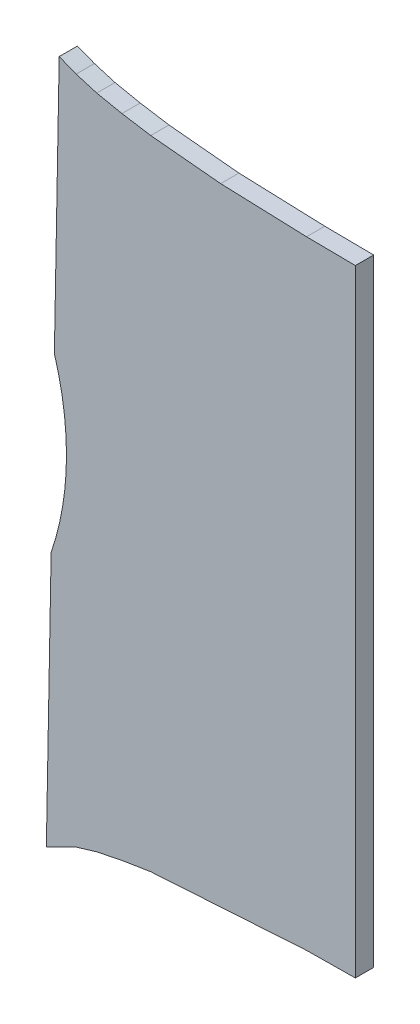
ISO-10303-21;
HEADER;
FILE_DESCRIPTION(('STEP AP214'),'2;1');
FILE_NAME('part.step','',(''),(''),'','','');
FILE_SCHEMA(('AUTOMOTIVE_DESIGN { 1 0 10303 214 1 1 1 1 }'));
ENDSEC;
DATA;
#1=APPLICATION_CONTEXT('core data for automotive mechanical design processes');
#2=APPLICATION_PROTOCOL_DEFINITION('international standard','automotive_design',2000,#1);
#3=PRODUCT_CONTEXT('',#1,'mechanical');
#4=PRODUCT('Part','Part','',(#3));
#5=PRODUCT_RELATED_PRODUCT_CATEGORY('part','',(#4));
#6=PRODUCT_DEFINITION_FORMATION('','',#4);
#7=PRODUCT_DEFINITION_CONTEXT('part definition',#1,'design');
#8=PRODUCT_DEFINITION('design','',#6,#7);
#9=PRODUCT_DEFINITION_SHAPE('','',#8);
#10=(LENGTH_UNIT() NAMED_UNIT(*) SI_UNIT(.MILLI.,.METRE.));
#11=(NAMED_UNIT(*) PLANE_ANGLE_UNIT() SI_UNIT($,.RADIAN.));
#12=(NAMED_UNIT(*) SI_UNIT($,.STERADIAN.) SOLID_ANGLE_UNIT());
#13=UNCERTAINTY_MEASURE_WITH_UNIT(LENGTH_MEASURE(1.E-05),#10,'distance_accuracy_value','');
#14=(GEOMETRIC_REPRESENTATION_CONTEXT(3) GLOBAL_UNCERTAINTY_ASSIGNED_CONTEXT((#13)) GLOBAL_UNIT_ASSIGNED_CONTEXT((#10,
#11,#12)) REPRESENTATION_CONTEXT('',''));
#15=CARTESIAN_POINT('',(0.,0.,0.));
#16=DIRECTION('',(0.,0.,1.));
#17=DIRECTION('',(1.,0.,0.));
#18=AXIS2_PLACEMENT_3D('',#15,#16,#17);
#19=CARTESIAN_POINT('',(104.657997131348,70.0309982299805,0.));
#20=DIRECTION('',(-1.,0.,0.));
#21=DIRECTION('',(0.,1.,0.));
#22=AXIS2_PLACEMENT_3D('',#19,#20,#21);
#23=PLANE('',#22);
#24=DIRECTION('',(0.,1.,0.));
#25=VECTOR('',#24,1.);
#26=CARTESIAN_POINT('',(104.657997131348,70.0309982299805,0.03556));
#27=LINE('',#26,#25);
#28=CARTESIAN_POINT('',(104.657997131348,70.0309982299805,0.03556));
#29=VERTEX_POINT('',#28);
#30=CARTESIAN_POINT('',(104.657997131348,71.2310028076172,0.03556));
#31=VERTEX_POINT('',#30);
#32=EDGE_CURVE('E11',#29,#31,#27,.T.);
#33=ORIENTED_EDGE('',*,*,#32,.F.);
#34=DIRECTION('',(0.,0.,1.));
#35=VECTOR('',#34,1.);
#36=CARTESIAN_POINT('',(104.657997131348,70.0309982299805,0.));
#37=LINE('',#36,#35);
#38=CARTESIAN_POINT('',(104.657997131348,70.0309982299805,0.));
#39=VERTEX_POINT('',#38);
#40=EDGE_CURVE('E24',#39,#29,#37,.T.);
#41=ORIENTED_EDGE('',*,*,#40,.F.);
#42=DIRECTION('',(0.,1.,0.));
#43=VECTOR('',#42,1.);
#44=CARTESIAN_POINT('',(104.657997131348,70.0309982299805,0.));
#45=LINE('',#44,#43);
#46=CARTESIAN_POINT('',(104.657997131348,71.2310028076172,0.));
#47=VERTEX_POINT('',#46);
#48=EDGE_CURVE('E281',#39,#47,#45,.T.);
#49=ORIENTED_EDGE('',*,*,#48,.T.);
#50=DIRECTION('',(0.,0.,1.));
#51=VECTOR('',#50,1.);
#52=CARTESIAN_POINT('',(104.657997131348,71.2310028076172,0.));
#53=LINE('',#52,#51);
#54=EDGE_CURVE('E37',#47,#31,#53,.T.);
#55=ORIENTED_EDGE('',*,*,#54,.T.);
#56=EDGE_LOOP('',(#33,#41,#49,#55));
#57=FACE_BOUND('',#56,.T.);
#58=ADVANCED_FACE('F17',(#57),#23,.F.);
#59=CARTESIAN_POINT('',(104.563003540039,70.0299987792969,0.));
#60=DIRECTION('',(-0.0105206609892561,0.999944656314713,0.));
#61=DIRECTION('',(0.999944656314713,0.0105206609892561,0.));
#62=AXIS2_PLACEMENT_3D('',#59,#60,#61);
#63=PLANE('',#62);
#64=DIRECTION('',(0.999944656314713,0.0105206609892561,0.));
#65=VECTOR('',#64,1.);
#66=CARTESIAN_POINT('',(104.563003540039,70.0299987792969,0.03556));
#67=LINE('',#66,#65);
#68=CARTESIAN_POINT('',(104.563003540039,70.0299987792969,0.03556));
#69=VERTEX_POINT('',#68);
#70=EDGE_CURVE('E277',#69,#29,#67,.T.);
#71=ORIENTED_EDGE('',*,*,#70,.F.);
#72=DIRECTION('',(0.,0.,1.));
#73=VECTOR('',#72,1.);
#74=CARTESIAN_POINT('',(104.563003540039,70.0299987792969,0.));
#75=LINE('',#74,#73);
#76=CARTESIAN_POINT('',(104.563003540039,70.0299987792969,0.));
#77=VERTEX_POINT('',#76);
#78=EDGE_CURVE('E275',#77,#69,#75,.T.);
#79=ORIENTED_EDGE('',*,*,#78,.F.);
#80=DIRECTION('',(0.999944656314713,0.0105206609892561,0.));
#81=VECTOR('',#80,1.);
#82=CARTESIAN_POINT('',(104.563003540039,70.0299987792969,0.));
#83=LINE('',#82,#81);
#84=EDGE_CURVE('E273',#77,#39,#83,.T.);
#85=ORIENTED_EDGE('',*,*,#84,.T.);
#86=ORIENTED_EDGE('',*,*,#40,.T.);
#87=EDGE_LOOP('',(#71,#79,#85,#86));
#88=FACE_BOUND('',#87,.T.);
#89=ADVANCED_FACE('F284',(#88),#63,.F.);
#90=CARTESIAN_POINT('',(104.26000213623,70.0110015869141,0.));
#91=DIRECTION('',(-0.0625738496276475,0.998040336530932,0.));
#92=DIRECTION('',(0.998040336530932,0.0625738496276475,0.));
#93=AXIS2_PLACEMENT_3D('',#90,#91,#92);
#94=PLANE('',#93);
#95=DIRECTION('',(0.998040336530932,0.0625738496276475,0.));
#96=VECTOR('',#95,1.);
#97=CARTESIAN_POINT('',(104.26000213623,70.0110015869141,0.03556));
#98=LINE('',#97,#96);
#99=CARTESIAN_POINT('',(104.26000213623,70.0110015869141,0.03556));
#100=VERTEX_POINT('',#99);
#101=EDGE_CURVE('E270',#100,#69,#98,.T.);
#102=ORIENTED_EDGE('',*,*,#101,.F.);
#103=DIRECTION('',(0.,0.,1.));
#104=VECTOR('',#103,1.);
#105=CARTESIAN_POINT('',(104.26000213623,70.0110015869141,0.));
#106=LINE('',#105,#104);
#107=CARTESIAN_POINT('',(104.26000213623,70.0110015869141,0.));
#108=VERTEX_POINT('',#107);
#109=EDGE_CURVE('E268',#108,#100,#106,.T.);
#110=ORIENTED_EDGE('',*,*,#109,.F.);
#111=DIRECTION('',(0.998040336530932,0.0625738496276475,0.));
#112=VECTOR('',#111,1.);
#113=CARTESIAN_POINT('',(104.26000213623,70.0110015869141,0.));
#114=LINE('',#113,#112);
#115=EDGE_CURVE('E265',#108,#77,#114,.T.);
#116=ORIENTED_EDGE('',*,*,#115,.T.);
#117=ORIENTED_EDGE('',*,*,#78,.T.);
#118=EDGE_LOOP('',(#102,#110,#116,#117));
#119=FACE_BOUND('',#118,.T.);
#120=ADVANCED_FACE('F287',(#119),#94,.F.);
#121=CARTESIAN_POINT('',(104.204002380371,70.0019989013672,0.));
#122=DIRECTION('',(-0.158724925844647,0.987322843813315,0.));
#123=DIRECTION('',(0.987322843813315,0.158724925844647,0.));
#124=AXIS2_PLACEMENT_3D('',#121,#122,#123);
#125=PLANE('',#124);
#126=DIRECTION('',(0.987322843813315,0.158724925844647,0.));
#127=VECTOR('',#126,1.);
#128=CARTESIAN_POINT('',(104.204002380371,70.0019989013672,0.03556));
#129=LINE('',#128,#127);
#130=CARTESIAN_POINT('',(104.204002380371,70.0019989013672,0.03556));
#131=VERTEX_POINT('',#130);
#132=EDGE_CURVE('E262',#131,#100,#129,.T.);
#133=ORIENTED_EDGE('',*,*,#132,.F.);
#134=DIRECTION('',(0.,0.,1.));
#135=VECTOR('',#134,1.);
#136=CARTESIAN_POINT('',(104.204002380371,70.0019989013672,0.));
#137=LINE('',#136,#135);
#138=CARTESIAN_POINT('',(104.204002380371,70.0019989013672,0.));
#139=VERTEX_POINT('',#138);
#140=EDGE_CURVE('E260',#139,#131,#137,.T.);
#141=ORIENTED_EDGE('',*,*,#140,.F.);
#142=DIRECTION('',(0.987322843813315,0.158724925844647,0.));
#143=VECTOR('',#142,1.);
#144=CARTESIAN_POINT('',(104.204002380371,70.0019989013672,0.));
#145=LINE('',#144,#143);
#146=EDGE_CURVE('E257',#139,#108,#145,.T.);
#147=ORIENTED_EDGE('',*,*,#146,.T.);
#148=ORIENTED_EDGE('',*,*,#109,.T.);
#149=EDGE_LOOP('',(#133,#141,#147,#148));
#150=FACE_BOUND('',#149,.T.);
#151=ADVANCED_FACE('F292',(#150),#125,.F.);
#152=CARTESIAN_POINT('',(104.154998779297,69.9919967651367,0.));
#153=DIRECTION('',(-0.199986910155218,0.979798568975567,0.));
#154=DIRECTION('',(0.979798568975567,0.199986910155218,0.));
#155=AXIS2_PLACEMENT_3D('',#152,#153,#154);
#156=PLANE('',#155);
#157=DIRECTION('',(0.979798568975567,0.199986910155218,0.));
#158=VECTOR('',#157,1.);
#159=CARTESIAN_POINT('',(104.154998779297,69.9919967651367,0.03556));
#160=LINE('',#159,#158);
#161=CARTESIAN_POINT('',(104.154998779297,69.9919967651367,0.03556));
#162=VERTEX_POINT('',#161);
#163=EDGE_CURVE('E254',#162,#131,#160,.T.);
#164=ORIENTED_EDGE('',*,*,#163,.F.);
#165=DIRECTION('',(0.,0.,1.));
#166=VECTOR('',#165,1.);
#167=CARTESIAN_POINT('',(104.154998779297,69.9919967651367,0.));
#168=LINE('',#167,#166);
#169=CARTESIAN_POINT('',(104.154998779297,69.9919967651367,0.));
#170=VERTEX_POINT('',#169);
#171=EDGE_CURVE('E252',#170,#162,#168,.T.);
#172=ORIENTED_EDGE('',*,*,#171,.F.);
#173=DIRECTION('',(0.979798568975567,0.199986910155218,0.));
#174=VECTOR('',#173,1.);
#175=CARTESIAN_POINT('',(104.154998779297,69.9919967651367,0.));
#176=LINE('',#175,#174);
#177=EDGE_CURVE('E249',#170,#139,#176,.T.);
#178=ORIENTED_EDGE('',*,*,#177,.T.);
#179=ORIENTED_EDGE('',*,*,#140,.T.);
#180=EDGE_LOOP('',(#164,#172,#178,#179));
#181=FACE_BOUND('',#180,.T.);
#182=ADVANCED_FACE('F295',(#181),#156,.F.);
#183=CARTESIAN_POINT('',(104.11499786377,69.9800033569336,0.));
#184=DIRECTION('',(-0.287197032661388,0.95787152814482,0.));
#185=DIRECTION('',(0.95787152814482,0.287197032661388,0.));
#186=AXIS2_PLACEMENT_3D('',#183,#184,#185);
#187=PLANE('',#186);
#188=DIRECTION('',(0.95787152814482,0.287197032661388,0.));
#189=VECTOR('',#188,1.);
#190=CARTESIAN_POINT('',(104.11499786377,69.9800033569336,0.03556));
#191=LINE('',#190,#189);
#192=CARTESIAN_POINT('',(104.11499786377,69.9800033569336,0.03556));
#193=VERTEX_POINT('',#192);
#194=EDGE_CURVE('E246',#193,#162,#191,.T.);
#195=ORIENTED_EDGE('',*,*,#194,.F.);
#196=DIRECTION('',(0.,0.,1.));
#197=VECTOR('',#196,1.);
#198=CARTESIAN_POINT('',(104.11499786377,69.9800033569336,0.));
#199=LINE('',#198,#197);
#200=CARTESIAN_POINT('',(104.11499786377,69.9800033569336,0.));
#201=VERTEX_POINT('',#200);
#202=EDGE_CURVE('E244',#201,#193,#199,.T.);
#203=ORIENTED_EDGE('',*,*,#202,.F.);
#204=DIRECTION('',(0.95787152814482,0.287197032661388,0.));
#205=VECTOR('',#204,1.);
#206=CARTESIAN_POINT('',(104.11499786377,69.9800033569336,0.));
#207=LINE('',#206,#205);
#208=EDGE_CURVE('E241',#201,#170,#207,.T.);
#209=ORIENTED_EDGE('',*,*,#208,.T.);
#210=ORIENTED_EDGE('',*,*,#171,.T.);
#211=EDGE_LOOP('',(#195,#203,#209,#210));
#212=FACE_BOUND('',#211,.T.);
#213=ADVANCED_FACE('F300',(#212),#187,.F.);
#214=CARTESIAN_POINT('',(104.056999206543,69.9509963989258,0.));
#215=DIRECTION('',(-0.447307713531729,0.894380125793847,0.));
#216=DIRECTION('',(0.894380125793847,0.447307713531729,0.));
#217=AXIS2_PLACEMENT_3D('',#214,#215,#216);
#218=PLANE('',#217);
#219=DIRECTION('',(0.894380125793847,0.447307713531729,0.));
#220=VECTOR('',#219,1.);
#221=CARTESIAN_POINT('',(104.056999206543,69.9509963989258,0.03556));
#222=LINE('',#221,#220);
#223=CARTESIAN_POINT('',(104.056999206543,69.9509963989258,0.03556));
#224=VERTEX_POINT('',#223);
#225=EDGE_CURVE('E238',#224,#193,#222,.T.);
#226=ORIENTED_EDGE('',*,*,#225,.F.);
#227=DIRECTION('',(0.,0.,1.));
#228=VECTOR('',#227,1.);
#229=CARTESIAN_POINT('',(104.056999206543,69.9509963989258,0.));
#230=LINE('',#229,#228);
#231=CARTESIAN_POINT('',(104.056999206543,69.9509963989258,0.));
#232=VERTEX_POINT('',#231);
#233=EDGE_CURVE('E236',#232,#224,#230,.T.);
#234=ORIENTED_EDGE('',*,*,#233,.F.);
#235=DIRECTION('',(0.894380125793847,0.447307713531729,0.));
#236=VECTOR('',#235,1.);
#237=CARTESIAN_POINT('',(104.056999206543,69.9509963989258,0.));
#238=LINE('',#237,#236);
#239=EDGE_CURVE('E233',#232,#201,#238,.T.);
#240=ORIENTED_EDGE('',*,*,#239,.T.);
#241=ORIENTED_EDGE('',*,*,#202,.T.);
#242=EDGE_LOOP('',(#226,#234,#240,#241));
#243=FACE_BOUND('',#242,.T.);
#244=ADVANCED_FACE('F303',(#243),#218,.F.);
#245=CARTESIAN_POINT('',(104.066322617947,70.4521930655177,0.));
#246=DIRECTION('',(0.999827022085491,-0.0185990835166362,0.));
#247=DIRECTION('',(-0.0185990835166362,-0.999827022085491,0.));
#248=AXIS2_PLACEMENT_3D('',#245,#246,#247);
#249=PLANE('',#248);
#250=DIRECTION('',(-0.0185990835166362,-0.999827022085491,0.));
#251=VECTOR('',#250,1.);
#252=CARTESIAN_POINT('',(104.082000732422,71.2949981689453,0.03556));
#253=LINE('',#252,#251);
#254=CARTESIAN_POINT('',(104.066322617947,70.4521930655177,0.03556));
#255=VERTEX_POINT('',#254);
#256=EDGE_CURVE('E230',#255,#224,#253,.T.);
#257=ORIENTED_EDGE('',*,*,#256,.F.);
#258=DIRECTION('',(0.,0.,1.));
#259=VECTOR('',#258,1.);
#260=CARTESIAN_POINT('',(104.066322617947,70.4521930655177,0.));
#261=LINE('',#260,#259);
#262=CARTESIAN_POINT('',(104.066322617947,70.4521930655177,0.));
#263=VERTEX_POINT('',#262);
#264=EDGE_CURVE('E228',#263,#255,#261,.T.);
#265=ORIENTED_EDGE('',*,*,#264,.F.);
#266=DIRECTION('',(-0.0185990835166362,-0.999827022085491,0.));
#267=VECTOR('',#266,1.);
#268=CARTESIAN_POINT('',(104.082000732422,71.2949981689453,0.));
#269=LINE('',#268,#267);
#270=EDGE_CURVE('E225',#263,#232,#269,.T.);
#271=ORIENTED_EDGE('',*,*,#270,.T.);
#272=ORIENTED_EDGE('',*,*,#233,.T.);
#273=EDGE_LOOP('',(#257,#265,#271,#272));
#274=FACE_BOUND('',#273,.T.);
#275=ADVANCED_FACE('F308',(#274),#249,.F.);
#276=CARTESIAN_POINT('',(103.546148,70.6308468,0.));
#277=DIRECTION('',(0.,0.,-1.));
#278=DIRECTION('',(1.,0.,0.));
#279=AXIS2_PLACEMENT_3D('',#276,#277,#278);
#280=CYLINDRICAL_SURFACE('',#279,0.5499989);
#281=ORIENTED_EDGE('',*,*,#264,.T.);
#282=CARTESIAN_POINT('',(103.546148,70.6308468,0.03556));
#283=DIRECTION('',(0.,0.,1.));
#284=DIRECTION('',(1.,0.,0.));
#285=AXIS2_PLACEMENT_3D('',#282,#283,#284);
#286=CIRCLE('',#285,0.5499989);
#287=CARTESIAN_POINT('',(104.0961469,70.6308468,0.03556));
#288=VERTEX_POINT('',#287);
#289=EDGE_CURVE('E222',#255,#288,#286,.T.);
#290=ORIENTED_EDGE('',*,*,#289,.T.);
#291=DIRECTION('',(0.,0.,1.));
#292=VECTOR('',#291,1.);
#293=CARTESIAN_POINT('',(104.0961469,70.6308468,0.));
#294=LINE('',#293,#292);
#295=CARTESIAN_POINT('',(104.0961469,70.6308468,0.));
#296=VERTEX_POINT('',#295);
#297=EDGE_CURVE('E220',#296,#288,#294,.T.);
#298=ORIENTED_EDGE('',*,*,#297,.F.);
#299=CARTESIAN_POINT('',(103.546148,70.6308468,0.));
#300=DIRECTION('',(0.,0.,1.));
#301=DIRECTION('',(1.,0.,0.));
#302=AXIS2_PLACEMENT_3D('',#299,#300,#301);
#303=CIRCLE('',#302,0.5499989);
#304=EDGE_CURVE('E217',#263,#296,#303,.T.);
#305=ORIENTED_EDGE('',*,*,#304,.F.);
#306=EDGE_LOOP('',(#281,#290,#298,#305));
#307=FACE_BOUND('',#306,.T.);
#308=ADVANCED_FACE('F311',(#307),#280,.F.);
#309=CARTESIAN_POINT('',(103.546148,70.6308468,0.));
#310=DIRECTION('',(0.,0.,-1.));
#311=DIRECTION('',(1.,0.,0.));
#312=AXIS2_PLACEMENT_3D('',#309,#310,#311);
#313=CYLINDRICAL_SURFACE('',#312,0.5499989);
#314=ORIENTED_EDGE('',*,*,#297,.T.);
#315=CARTESIAN_POINT('',(103.546148,70.6308468,0.03556));
#316=DIRECTION('',(0.,0.,1.));
#317=DIRECTION('',(1.,0.,0.));
#318=AXIS2_PLACEMENT_3D('',#315,#316,#317);
#319=CIRCLE('',#318,0.5499989);
#320=CARTESIAN_POINT('',(104.07260717611,70.7900307372904,0.03556));
#321=VERTEX_POINT('',#320);
#322=EDGE_CURVE('E214',#288,#321,#319,.T.);
#323=ORIENTED_EDGE('',*,*,#322,.T.);
#324=DIRECTION('',(0.,0.,1.));
#325=VECTOR('',#324,1.);
#326=CARTESIAN_POINT('',(104.07260717611,70.7900307372904,0.));
#327=LINE('',#326,#325);
#328=CARTESIAN_POINT('',(104.07260717611,70.7900307372904,0.));
#329=VERTEX_POINT('',#328);
#330=EDGE_CURVE('E212',#329,#321,#327,.T.);
#331=ORIENTED_EDGE('',*,*,#330,.F.);
#332=EDGE_CURVE('E211',#296,#329,#303,.T.);
#333=ORIENTED_EDGE('',*,*,#332,.F.);
#334=EDGE_LOOP('',(#314,#323,#331,#333));
#335=FACE_BOUND('',#334,.T.);
#336=ADVANCED_FACE('F318',(#335),#313,.F.);
#337=CARTESIAN_POINT('',(104.082000732422,71.2949981689453,0.));
#338=DIRECTION('',(0.999827022085491,-0.0185990835166362,0.));
#339=DIRECTION('',(-0.0185990835166362,-0.999827022085491,0.));
#340=AXIS2_PLACEMENT_3D('',#337,#338,#339);
#341=PLANE('',#340);
#342=DIRECTION('',(-0.0185990835166362,-0.999827022085491,0.));
#343=VECTOR('',#342,1.);
#344=CARTESIAN_POINT('',(104.082000732422,71.2949981689453,0.03556));
#345=LINE('',#344,#343);
#346=CARTESIAN_POINT('',(104.082000732422,71.2949981689453,0.03556));
#347=VERTEX_POINT('',#346);
#348=EDGE_CURVE('E208',#347,#321,#345,.T.);
#349=ORIENTED_EDGE('',*,*,#348,.F.);
#350=DIRECTION('',(0.,0.,1.));
#351=VECTOR('',#350,1.);
#352=CARTESIAN_POINT('',(104.082000732422,71.2949981689453,0.));
#353=LINE('',#352,#351);
#354=CARTESIAN_POINT('',(104.082000732422,71.2949981689453,0.));
#355=VERTEX_POINT('',#354);
#356=EDGE_CURVE('E206',#355,#347,#353,.T.);
#357=ORIENTED_EDGE('',*,*,#356,.F.);
#358=EDGE_CURVE('E205',#355,#329,#269,.T.);
#359=ORIENTED_EDGE('',*,*,#358,.T.);
#360=ORIENTED_EDGE('',*,*,#330,.T.);
#361=EDGE_LOOP('',(#349,#357,#359,#360));
#362=FACE_BOUND('',#361,.T.);
#363=ADVANCED_FACE('F321',(#362),#341,.F.);
#364=CARTESIAN_POINT('',(104.11499786377,71.2819976806641,0.));
#365=DIRECTION('',(-0.366564019369772,-0.93039283085344,0.));
#366=DIRECTION('',(-0.93039283085344,0.366564019369772,0.));
#367=AXIS2_PLACEMENT_3D('',#364,#365,#366);
#368=PLANE('',#367);
#369=DIRECTION('',(-0.93039283085344,0.366564019369772,0.));
#370=VECTOR('',#369,1.);
#371=CARTESIAN_POINT('',(104.11499786377,71.2819976806641,0.03556));
#372=LINE('',#371,#370);
#373=CARTESIAN_POINT('',(104.11499786377,71.2819976806641,0.03556));
#374=VERTEX_POINT('',#373);
#375=EDGE_CURVE('E202',#374,#347,#372,.T.);
#376=ORIENTED_EDGE('',*,*,#375,.F.);
#377=DIRECTION('',(0.,0.,1.));
#378=VECTOR('',#377,1.);
#379=CARTESIAN_POINT('',(104.11499786377,71.2819976806641,0.));
#380=LINE('',#379,#378);
#381=CARTESIAN_POINT('',(104.11499786377,71.2819976806641,0.));
#382=VERTEX_POINT('',#381);
#383=EDGE_CURVE('E200',#382,#374,#380,.T.);
#384=ORIENTED_EDGE('',*,*,#383,.F.);
#385=DIRECTION('',(-0.93039283085344,0.366564019369772,0.));
#386=VECTOR('',#385,1.);
#387=CARTESIAN_POINT('',(104.11499786377,71.2819976806641,0.));
#388=LINE('',#387,#386);
#389=EDGE_CURVE('E197',#382,#355,#388,.T.);
#390=ORIENTED_EDGE('',*,*,#389,.T.);
#391=ORIENTED_EDGE('',*,*,#356,.T.);
#392=EDGE_LOOP('',(#376,#384,#390,#391));
#393=FACE_BOUND('',#392,.T.);
#394=ADVANCED_FACE('F326',(#393),#368,.F.);
#395=CARTESIAN_POINT('',(104.154998779297,71.2699966430664,0.));
#396=DIRECTION('',(-0.287364645680626,-0.957821257027034,0.));
#397=DIRECTION('',(-0.957821257027034,0.287364645680626,0.));
#398=AXIS2_PLACEMENT_3D('',#395,#396,#397);
#399=PLANE('',#398);
#400=DIRECTION('',(-0.957821257027034,0.287364645680626,0.));
#401=VECTOR('',#400,1.);
#402=CARTESIAN_POINT('',(104.154998779297,71.2699966430664,0.03556));
#403=LINE('',#402,#401);
#404=CARTESIAN_POINT('',(104.154998779297,71.2699966430664,0.03556));
#405=VERTEX_POINT('',#404);
#406=EDGE_CURVE('E194',#405,#374,#403,.T.);
#407=ORIENTED_EDGE('',*,*,#406,.F.);
#408=DIRECTION('',(0.,0.,1.));
#409=VECTOR('',#408,1.);
#410=CARTESIAN_POINT('',(104.154998779297,71.2699966430664,0.));
#411=LINE('',#410,#409);
#412=CARTESIAN_POINT('',(104.154998779297,71.2699966430664,0.));
#413=VERTEX_POINT('',#412);
#414=EDGE_CURVE('E192',#413,#405,#411,.T.);
#415=ORIENTED_EDGE('',*,*,#414,.F.);
#416=DIRECTION('',(-0.957821257027034,0.287364645680626,0.));
#417=VECTOR('',#416,1.);
#418=CARTESIAN_POINT('',(104.154998779297,71.2699966430664,0.));
#419=LINE('',#418,#417);
#420=EDGE_CURVE('E189',#413,#382,#419,.T.);
#421=ORIENTED_EDGE('',*,*,#420,.T.);
#422=ORIENTED_EDGE('',*,*,#383,.T.);
#423=EDGE_LOOP('',(#407,#415,#421,#422));
#424=FACE_BOUND('',#423,.T.);
#425=ADVANCED_FACE('F329',(#424),#399,.F.);
#426=CARTESIAN_POINT('',(104.204002380371,71.2600021362305,0.));
#427=DIRECTION('',(-0.199840459152507,-0.97982844972256,0.));
#428=DIRECTION('',(-0.97982844972256,0.199840459152507,0.));
#429=AXIS2_PLACEMENT_3D('',#426,#427,#428);
#430=PLANE('',#429);
#431=DIRECTION('',(-0.97982844972256,0.199840459152507,0.));
#432=VECTOR('',#431,1.);
#433=CARTESIAN_POINT('',(104.204002380371,71.2600021362305,0.03556));
#434=LINE('',#433,#432);
#435=CARTESIAN_POINT('',(104.204002380371,71.2600021362305,0.03556));
#436=VERTEX_POINT('',#435);
#437=EDGE_CURVE('E186',#436,#405,#434,.T.);
#438=ORIENTED_EDGE('',*,*,#437,.F.);
#439=DIRECTION('',(0.,0.,1.));
#440=VECTOR('',#439,1.);
#441=CARTESIAN_POINT('',(104.204002380371,71.2600021362305,0.));
#442=LINE('',#441,#440);
#443=CARTESIAN_POINT('',(104.204002380371,71.2600021362305,0.));
#444=VERTEX_POINT('',#443);
#445=EDGE_CURVE('E184',#444,#436,#442,.T.);
#446=ORIENTED_EDGE('',*,*,#445,.F.);
#447=DIRECTION('',(-0.97982844972256,0.199840459152507,0.));
#448=VECTOR('',#447,1.);
#449=CARTESIAN_POINT('',(104.204002380371,71.2600021362305,0.));
#450=LINE('',#449,#448);
#451=EDGE_CURVE('E181',#444,#413,#450,.T.);
#452=ORIENTED_EDGE('',*,*,#451,.T.);
#453=ORIENTED_EDGE('',*,*,#414,.T.);
#454=EDGE_LOOP('',(#438,#446,#452,#453));
#455=FACE_BOUND('',#454,.T.);
#456=ADVANCED_FACE('F333',(#455),#430,.F.);
#457=CARTESIAN_POINT('',(104.26000213623,71.2509994506836,0.));
#458=DIRECTION('',(-0.158724925844647,-0.987322843813315,0.));
#459=DIRECTION('',(-0.987322843813315,0.158724925844647,0.));
#460=AXIS2_PLACEMENT_3D('',#457,#458,#459);
#461=PLANE('',#460);
#462=DIRECTION('',(-0.987322843813315,0.158724925844647,0.));
#463=VECTOR('',#462,1.);
#464=CARTESIAN_POINT('',(104.26000213623,71.2509994506836,0.03556));
#465=LINE('',#464,#463);
#466=CARTESIAN_POINT('',(104.26000213623,71.2509994506836,0.03556));
#467=VERTEX_POINT('',#466);
#468=EDGE_CURVE('E178',#467,#436,#465,.T.);
#469=ORIENTED_EDGE('',*,*,#468,.F.);
#470=DIRECTION('',(0.,0.,1.));
#471=VECTOR('',#470,1.);
#472=CARTESIAN_POINT('',(104.26000213623,71.2509994506836,0.));
#473=LINE('',#472,#471);
#474=CARTESIAN_POINT('',(104.26000213623,71.2509994506836,0.));
#475=VERTEX_POINT('',#474);
#476=EDGE_CURVE('E176',#475,#467,#473,.T.);
#477=ORIENTED_EDGE('',*,*,#476,.F.);
#478=DIRECTION('',(-0.987322843813315,0.158724925844647,0.));
#479=VECTOR('',#478,1.);
#480=CARTESIAN_POINT('',(104.26000213623,71.2509994506836,0.));
#481=LINE('',#480,#479);
#482=EDGE_CURVE('E173',#475,#444,#481,.T.);
#483=ORIENTED_EDGE('',*,*,#482,.T.);
#484=ORIENTED_EDGE('',*,*,#445,.T.);
#485=EDGE_LOOP('',(#469,#477,#483,#484));
#486=FACE_BOUND('',#485,.T.);
#487=ADVANCED_FACE('F336',(#486),#461,.F.);
#488=CARTESIAN_POINT('',(104.396003723145,71.2379989624023,0.));
#489=DIRECTION('',(-0.0951569465430121,-0.99546228232144,0.));
#490=DIRECTION('',(-0.99546228232144,0.0951569465430121,0.));
#491=AXIS2_PLACEMENT_3D('',#488,#489,#490);
#492=PLANE('',#491);
#493=DIRECTION('',(-0.99546228232144,0.0951569465430121,0.));
#494=VECTOR('',#493,1.);
#495=CARTESIAN_POINT('',(104.396003723145,71.2379989624023,0.03556));
#496=LINE('',#495,#494);
#497=CARTESIAN_POINT('',(104.396003723145,71.2379989624023,0.03556));
#498=VERTEX_POINT('',#497);
#499=EDGE_CURVE('E170',#498,#467,#496,.T.);
#500=ORIENTED_EDGE('',*,*,#499,.F.);
#501=DIRECTION('',(0.,0.,1.));
#502=VECTOR('',#501,1.);
#503=CARTESIAN_POINT('',(104.396003723145,71.2379989624023,0.));
#504=LINE('',#503,#502);
#505=CARTESIAN_POINT('',(104.396003723145,71.2379989624023,0.));
#506=VERTEX_POINT('',#505);
#507=EDGE_CURVE('E168',#506,#498,#504,.T.);
#508=ORIENTED_EDGE('',*,*,#507,.F.);
#509=DIRECTION('',(-0.99546228232144,0.0951569465430121,0.));
#510=VECTOR('',#509,1.);
#511=CARTESIAN_POINT('',(104.396003723145,71.2379989624023,0.));
#512=LINE('',#511,#510);
#513=EDGE_CURVE('E159',#506,#475,#512,.T.);
#514=ORIENTED_EDGE('',*,*,#513,.T.);
#515=ORIENTED_EDGE('',*,*,#476,.T.);
#516=EDGE_LOOP('',(#500,#508,#514,#515));
#517=FACE_BOUND('',#516,.T.);
#518=ADVANCED_FACE('F339',(#517),#492,.F.);
#519=CARTESIAN_POINT('',(104.563003540039,71.2320022583008,0.));
#520=DIRECTION('',(-0.0358853190556377,-0.999355914515082,0.));
#521=DIRECTION('',(-0.999355914515082,0.0358853190556377,0.));
#522=AXIS2_PLACEMENT_3D('',#519,#520,#521);
#523=PLANE('',#522);
#524=DIRECTION('',(-0.999355914515082,0.0358853190556377,0.));
#525=VECTOR('',#524,1.);
#526=CARTESIAN_POINT('',(104.563003540039,71.2320022583008,0.03556));
#527=LINE('',#526,#525);
#528=CARTESIAN_POINT('',(104.563003540039,71.2320022583008,0.03556));
#529=VERTEX_POINT('',#528);
#530=EDGE_CURVE('E145',#529,#498,#527,.T.);
#531=ORIENTED_EDGE('',*,*,#530,.F.);
#532=DIRECTION('',(0.,0.,1.));
#533=VECTOR('',#532,1.);
#534=CARTESIAN_POINT('',(104.563003540039,71.2320022583008,0.));
#535=LINE('',#534,#533);
#536=CARTESIAN_POINT('',(104.563003540039,71.2320022583008,0.));
#537=VERTEX_POINT('',#536);
#538=EDGE_CURVE('E140',#537,#529,#535,.T.);
#539=ORIENTED_EDGE('',*,*,#538,.F.);
#540=DIRECTION('',(-0.999355914515082,0.0358853190556377,0.));
#541=VECTOR('',#540,1.);
#542=CARTESIAN_POINT('',(104.563003540039,71.2320022583008,0.));
#543=LINE('',#542,#541);
#544=EDGE_CURVE('E143',#537,#506,#543,.T.);
#545=ORIENTED_EDGE('',*,*,#544,.T.);
#546=ORIENTED_EDGE('',*,*,#507,.T.);
#547=EDGE_LOOP('',(#531,#539,#545,#546));
#548=FACE_BOUND('',#547,.T.);
#549=ADVANCED_FACE('F142',(#548),#523,.F.);
#550=CARTESIAN_POINT('',(104.657997131348,71.2310028076172,0.));
#551=DIRECTION('',(-0.0105206609892561,-0.999944656314713,0.));
#552=DIRECTION('',(-0.999944656314713,0.0105206609892561,0.));
#553=AXIS2_PLACEMENT_3D('',#550,#551,#552);
#554=PLANE('',#553);
#555=DIRECTION('',(-0.999944656314713,0.0105206609892561,0.));
#556=VECTOR('',#555,1.);
#557=CARTESIAN_POINT('',(104.657997131348,71.2310028076172,0.03556));
#558=LINE('',#557,#556);
#559=EDGE_CURVE('E160',#31,#529,#558,.T.);
#560=ORIENTED_EDGE('',*,*,#559,.F.);
#561=ORIENTED_EDGE('',*,*,#54,.F.);
#562=DIRECTION('',(-0.999944656314713,0.0105206609892561,0.));
#563=VECTOR('',#562,1.);
#564=CARTESIAN_POINT('',(104.657997131348,71.2310028076172,0.));
#565=LINE('',#564,#563);
#566=EDGE_CURVE('E156',#47,#537,#565,.T.);
#567=ORIENTED_EDGE('',*,*,#566,.T.);
#568=ORIENTED_EDGE('',*,*,#538,.T.);
#569=EDGE_LOOP('',(#560,#561,#567,#568));
#570=FACE_BOUND('',#569,.T.);
#571=ADVANCED_FACE('F162',(#570),#554,.F.);
#572=CARTESIAN_POINT('',(104.657997131348,71.2310028076172,0.));
#573=DIRECTION('',(0.,0.,1.));
#574=DIRECTION('',(1.,0.,0.));
#575=AXIS2_PLACEMENT_3D('',#572,#573,#574);
#576=PLANE('',#575);
#577=ORIENTED_EDGE('',*,*,#566,.F.);
#578=ORIENTED_EDGE('',*,*,#48,.F.);
#579=ORIENTED_EDGE('',*,*,#84,.F.);
#580=ORIENTED_EDGE('',*,*,#115,.F.);
#581=ORIENTED_EDGE('',*,*,#146,.F.);
#582=ORIENTED_EDGE('',*,*,#177,.F.);
#583=ORIENTED_EDGE('',*,*,#208,.F.);
#584=ORIENTED_EDGE('',*,*,#239,.F.);
#585=ORIENTED_EDGE('',*,*,#270,.F.);
#586=ORIENTED_EDGE('',*,*,#304,.T.);
#587=ORIENTED_EDGE('',*,*,#332,.T.);
#588=ORIENTED_EDGE('',*,*,#358,.F.);
#589=ORIENTED_EDGE('',*,*,#389,.F.);
#590=ORIENTED_EDGE('',*,*,#420,.F.);
#591=ORIENTED_EDGE('',*,*,#451,.F.);
#592=ORIENTED_EDGE('',*,*,#482,.F.);
#593=ORIENTED_EDGE('',*,*,#513,.F.);
#594=ORIENTED_EDGE('',*,*,#544,.F.);
#595=EDGE_LOOP('',(#577,#578,#579,#580,#581,#582,#583,#584,#585,#586,#587,#588,#589,#590,#591,
#592,#593,#594));
#596=FACE_BOUND('',#595,.T.);
#597=ADVANCED_FACE('F154',(#596),#576,.F.);
#598=CARTESIAN_POINT('',(104.657997131348,71.2310028076172,0.03556));
#599=DIRECTION('',(0.,0.,1.));
#600=DIRECTION('',(1.,0.,0.));
#601=AXIS2_PLACEMENT_3D('',#598,#599,#600);
#602=PLANE('',#601);
#603=ORIENTED_EDGE('',*,*,#32,.T.);
#604=ORIENTED_EDGE('',*,*,#559,.T.);
#605=ORIENTED_EDGE('',*,*,#530,.T.);
#606=ORIENTED_EDGE('',*,*,#499,.T.);
#607=ORIENTED_EDGE('',*,*,#468,.T.);
#608=ORIENTED_EDGE('',*,*,#437,.T.);
#609=ORIENTED_EDGE('',*,*,#406,.T.);
#610=ORIENTED_EDGE('',*,*,#375,.T.);
#611=ORIENTED_EDGE('',*,*,#348,.T.);
#612=ORIENTED_EDGE('',*,*,#322,.F.);
#613=ORIENTED_EDGE('',*,*,#289,.F.);
#614=ORIENTED_EDGE('',*,*,#256,.T.);
#615=ORIENTED_EDGE('',*,*,#225,.T.);
#616=ORIENTED_EDGE('',*,*,#194,.T.);
#617=ORIENTED_EDGE('',*,*,#163,.T.);
#618=ORIENTED_EDGE('',*,*,#132,.T.);
#619=ORIENTED_EDGE('',*,*,#101,.T.);
#620=ORIENTED_EDGE('',*,*,#70,.T.);
#621=EDGE_LOOP('',(#603,#604,#605,#606,#607,#608,#609,#610,#611,#612,#613,#614,#615,#616,#617,
#618,#619,#620));
#622=FACE_BOUND('',#621,.T.);
#623=ADVANCED_FACE('F341',(#622),#602,.T.);
#624=CLOSED_SHELL('',(#58,#89,#120,#151,#182,#213,#244,#275,#308,#336,#363,#394,#425,#456,#487,
#518,#549,#571,#597,#623));
#625=MANIFOLD_SOLID_BREP('B1',#624);
#626=ADVANCED_BREP_SHAPE_REPRESENTATION('',(#18,#625),#14);
#627=SHAPE_DEFINITION_REPRESENTATION(#9,#626);
ENDSEC;
END-ISO-10303-21;
